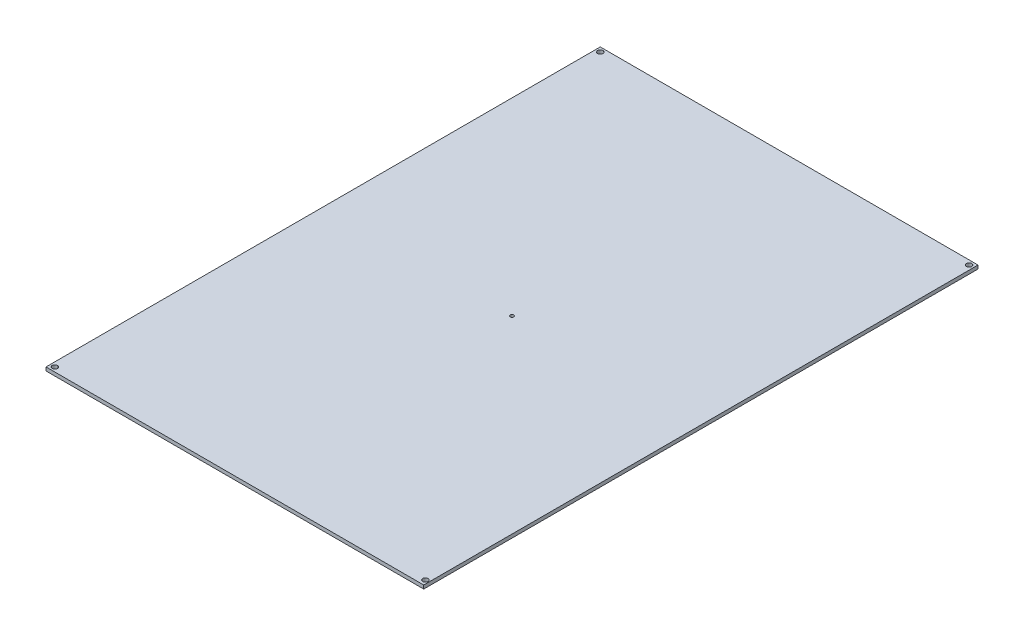
ISO-10303-21;
HEADER;
FILE_DESCRIPTION(('STEP AP214'),'2;1');
FILE_NAME('part.step','',(''),(''),'','','');
FILE_SCHEMA(('AUTOMOTIVE_DESIGN { 1 0 10303 214 1 1 1 1 }'));
ENDSEC;
DATA;
#1=APPLICATION_CONTEXT('core data for automotive mechanical design processes');
#2=APPLICATION_PROTOCOL_DEFINITION('international standard','automotive_design',2000,#1);
#3=PRODUCT_CONTEXT('',#1,'mechanical');
#4=PRODUCT('Part','Part','',(#3));
#5=PRODUCT_RELATED_PRODUCT_CATEGORY('part','',(#4));
#6=PRODUCT_DEFINITION_FORMATION('','',#4);
#7=PRODUCT_DEFINITION_CONTEXT('part definition',#1,'design');
#8=PRODUCT_DEFINITION('design','',#6,#7);
#9=PRODUCT_DEFINITION_SHAPE('','',#8);
#10=(LENGTH_UNIT() NAMED_UNIT(*) SI_UNIT(.MILLI.,.METRE.));
#11=(NAMED_UNIT(*) PLANE_ANGLE_UNIT() SI_UNIT($,.RADIAN.));
#12=(NAMED_UNIT(*) SI_UNIT($,.STERADIAN.) SOLID_ANGLE_UNIT());
#13=UNCERTAINTY_MEASURE_WITH_UNIT(LENGTH_MEASURE(1.E-05),#10,'distance_accuracy_value','');
#14=(GEOMETRIC_REPRESENTATION_CONTEXT(3) GLOBAL_UNCERTAINTY_ASSIGNED_CONTEXT((#13)) GLOBAL_UNIT_ASSIGNED_CONTEXT((#10,
#11,#12)) REPRESENTATION_CONTEXT('',''));
#15=CARTESIAN_POINT('',(0.,0.,0.));
#16=DIRECTION('',(0.,0.,1.));
#17=DIRECTION('',(1.,0.,0.));
#18=AXIS2_PLACEMENT_3D('',#15,#16,#17);
#19=CARTESIAN_POINT('',(0.,2.,0.));
#20=DIRECTION('',(0.,-1.,0.));
#21=DIRECTION('',(0.,0.,-1.));
#22=AXIS2_PLACEMENT_3D('',#19,#20,#21);
#23=PLANE('',#22);
#24=DIRECTION('',(0.,0.,-1.));
#25=VECTOR('',#24,1.);
#26=CARTESIAN_POINT('',(107.,2.,157.));
#27=LINE('',#26,#25);
#28=CARTESIAN_POINT('',(107.,2.,157.));
#29=VERTEX_POINT('',#28);
#30=CARTESIAN_POINT('',(107.,2.,-157.));
#31=VERTEX_POINT('',#30);
#32=EDGE_CURVE('E86',#29,#31,#27,.T.);
#33=ORIENTED_EDGE('',*,*,#32,.T.);
#34=DIRECTION('',(-1.,0.,0.));
#35=VECTOR('',#34,1.);
#36=CARTESIAN_POINT('',(-107.,2.,-157.));
#37=LINE('',#36,#35);
#38=CARTESIAN_POINT('',(-107.,2.,-157.));
#39=VERTEX_POINT('',#38);
#40=EDGE_CURVE('E81',#31,#39,#37,.T.);
#41=ORIENTED_EDGE('',*,*,#40,.T.);
#42=DIRECTION('',(0.,0.,1.));
#43=VECTOR('',#42,1.);
#44=CARTESIAN_POINT('',(-107.,2.,157.));
#45=LINE('',#44,#43);
#46=CARTESIAN_POINT('',(-107.,2.,157.));
#47=VERTEX_POINT('',#46);
#48=EDGE_CURVE('E84',#39,#47,#45,.T.);
#49=ORIENTED_EDGE('',*,*,#48,.T.);
#50=DIRECTION('',(1.,0.,0.));
#51=VECTOR('',#50,1.);
#52=CARTESIAN_POINT('',(-107.,2.,157.));
#53=LINE('',#52,#51);
#54=EDGE_CURVE('E51',#47,#29,#53,.T.);
#55=ORIENTED_EDGE('',*,*,#54,.T.);
#56=EDGE_LOOP('',(#33,#41,#49,#55));
#57=FACE_BOUND('',#56,.T.);
#58=CARTESIAN_POINT('',(-104.499999999994,2.,-154.500000000006));
#59=DIRECTION('',(0.,1.,0.));
#60=DIRECTION('',(0.,0.,1.));
#61=AXIS2_PLACEMENT_3D('',#58,#59,#60);
#62=CIRCLE('',#61,1.5);
#63=CARTESIAN_POINT('',(-104.499999999994,2.,-153.000000000006));
#64=VERTEX_POINT('',#63);
#65=EDGE_CURVE('E101',#64,#64,#62,.T.);
#66=ORIENTED_EDGE('',*,*,#65,.F.);
#67=EDGE_LOOP('',(#66));
#68=FACE_BOUND('',#67,.T.);
#69=CARTESIAN_POINT('',(0.,2.,0.));
#70=DIRECTION('',(0.,1.,0.));
#71=DIRECTION('',(0.,0.,1.));
#72=AXIS2_PLACEMENT_3D('',#69,#70,#71);
#73=CIRCLE('',#72,1.);
#74=CARTESIAN_POINT('',(0.,2.,1.));
#75=VERTEX_POINT('',#74);
#76=EDGE_CURVE('E116',#75,#75,#73,.T.);
#77=ORIENTED_EDGE('',*,*,#76,.F.);
#78=EDGE_LOOP('',(#77));
#79=FACE_BOUND('',#78,.T.);
#80=CARTESIAN_POINT('',(104.500000000006,2.,-154.5));
#81=DIRECTION('',(0.,1.,0.));
#82=DIRECTION('',(0.,0.,1.));
#83=AXIS2_PLACEMENT_3D('',#80,#81,#82);
#84=CIRCLE('',#83,1.5);
#85=CARTESIAN_POINT('',(104.500000000006,2.,-153.));
#86=VERTEX_POINT('',#85);
#87=EDGE_CURVE('E122',#86,#86,#84,.T.);
#88=ORIENTED_EDGE('',*,*,#87,.F.);
#89=EDGE_LOOP('',(#88));
#90=FACE_BOUND('',#89,.T.);
#91=CARTESIAN_POINT('',(105.00888101235,2.,154.078451578868));
#92=DIRECTION('',(0.,1.,0.));
#93=DIRECTION('',(0.,0.,1.));
#94=AXIS2_PLACEMENT_3D('',#91,#92,#93);
#95=CIRCLE('',#94,1.5);
#96=CARTESIAN_POINT('',(105.00888101235,2.,155.578451578868));
#97=VERTEX_POINT('',#96);
#98=EDGE_CURVE('E128',#97,#97,#95,.T.);
#99=ORIENTED_EDGE('',*,*,#98,.F.);
#100=EDGE_LOOP('',(#99));
#101=FACE_BOUND('',#100,.T.);
#102=CARTESIAN_POINT('',(-104.496841994602,2.,154.496841994597));
#103=DIRECTION('',(0.,1.,0.));
#104=DIRECTION('',(0.,0.,1.));
#105=AXIS2_PLACEMENT_3D('',#102,#103,#104);
#106=CIRCLE('',#105,1.5);
#107=CARTESIAN_POINT('',(-104.496841994602,2.,155.996841994597));
#108=VERTEX_POINT('',#107);
#109=EDGE_CURVE('E134',#108,#108,#106,.T.);
#110=ORIENTED_EDGE('',*,*,#109,.F.);
#111=EDGE_LOOP('',(#110));
#112=FACE_BOUND('',#111,.T.);
#113=ADVANCED_FACE('F34',(#57,#68,#79,#90,#101,#112),#23,.F.);
#114=CARTESIAN_POINT('',(0.,0.,0.));
#115=DIRECTION('',(0.,-1.,0.));
#116=DIRECTION('',(0.,0.,-1.));
#117=AXIS2_PLACEMENT_3D('',#114,#115,#116);
#118=PLANE('',#117);
#119=CARTESIAN_POINT('',(105.00888101235,0.,154.078451578868));
#120=DIRECTION('',(0.,1.,0.));
#121=DIRECTION('',(0.,0.,1.));
#122=AXIS2_PLACEMENT_3D('',#119,#120,#121);
#123=CIRCLE('',#122,1.5);
#124=CARTESIAN_POINT('',(105.00888101235,0.,155.578451578868));
#125=VERTEX_POINT('',#124);
#126=EDGE_CURVE('E131',#125,#125,#123,.T.);
#127=ORIENTED_EDGE('',*,*,#126,.T.);
#128=EDGE_LOOP('',(#127));
#129=FACE_BOUND('',#128,.T.);
#130=CARTESIAN_POINT('',(0.,0.,0.));
#131=DIRECTION('',(0.,1.,0.));
#132=DIRECTION('',(0.,0.,1.));
#133=AXIS2_PLACEMENT_3D('',#130,#131,#132);
#134=CIRCLE('',#133,1.);
#135=CARTESIAN_POINT('',(0.,0.,1.));
#136=VERTEX_POINT('',#135);
#137=EDGE_CURVE('E119',#136,#136,#134,.T.);
#138=ORIENTED_EDGE('',*,*,#137,.T.);
#139=EDGE_LOOP('',(#138));
#140=FACE_BOUND('',#139,.T.);
#141=DIRECTION('',(0.,0.,-1.));
#142=VECTOR('',#141,1.);
#143=CARTESIAN_POINT('',(107.,0.,157.));
#144=LINE('',#143,#142);
#145=CARTESIAN_POINT('',(107.,0.,157.));
#146=VERTEX_POINT('',#145);
#147=CARTESIAN_POINT('',(107.,0.,-157.));
#148=VERTEX_POINT('',#147);
#149=EDGE_CURVE('E98',#146,#148,#144,.T.);
#150=ORIENTED_EDGE('',*,*,#149,.F.);
#151=DIRECTION('',(1.,0.,0.));
#152=VECTOR('',#151,1.);
#153=CARTESIAN_POINT('',(-107.,0.,157.));
#154=LINE('',#153,#152);
#155=CARTESIAN_POINT('',(-107.,0.,157.));
#156=VERTEX_POINT('',#155);
#157=EDGE_CURVE('E74',#156,#146,#154,.T.);
#158=ORIENTED_EDGE('',*,*,#157,.F.);
#159=DIRECTION('',(0.,0.,1.));
#160=VECTOR('',#159,1.);
#161=CARTESIAN_POINT('',(-107.,0.,157.));
#162=LINE('',#161,#160);
#163=CARTESIAN_POINT('',(-107.,0.,-157.));
#164=VERTEX_POINT('',#163);
#165=EDGE_CURVE('E68',#164,#156,#162,.T.);
#166=ORIENTED_EDGE('',*,*,#165,.F.);
#167=DIRECTION('',(-1.,0.,0.));
#168=VECTOR('',#167,1.);
#169=CARTESIAN_POINT('',(-107.,0.,-157.));
#170=LINE('',#169,#168);
#171=EDGE_CURVE('E90',#148,#164,#170,.T.);
#172=ORIENTED_EDGE('',*,*,#171,.F.);
#173=EDGE_LOOP('',(#150,#158,#166,#172));
#174=FACE_BOUND('',#173,.T.);
#175=CARTESIAN_POINT('',(-104.499999999994,0.,-154.500000000006));
#176=DIRECTION('',(0.,1.,0.));
#177=DIRECTION('',(0.,0.,1.));
#178=AXIS2_PLACEMENT_3D('',#175,#176,#177);
#179=CIRCLE('',#178,1.5);
#180=CARTESIAN_POINT('',(-104.499999999994,0.,-153.000000000006));
#181=VERTEX_POINT('',#180);
#182=EDGE_CURVE('E113',#181,#181,#179,.T.);
#183=ORIENTED_EDGE('',*,*,#182,.T.);
#184=EDGE_LOOP('',(#183));
#185=FACE_BOUND('',#184,.T.);
#186=CARTESIAN_POINT('',(104.500000000006,0.,-154.5));
#187=DIRECTION('',(0.,1.,0.));
#188=DIRECTION('',(0.,0.,1.));
#189=AXIS2_PLACEMENT_3D('',#186,#187,#188);
#190=CIRCLE('',#189,1.5);
#191=CARTESIAN_POINT('',(104.500000000006,0.,-153.));
#192=VERTEX_POINT('',#191);
#193=EDGE_CURVE('E125',#192,#192,#190,.T.);
#194=ORIENTED_EDGE('',*,*,#193,.T.);
#195=EDGE_LOOP('',(#194));
#196=FACE_BOUND('',#195,.T.);
#197=CARTESIAN_POINT('',(-104.496841994602,0.,154.496841994597));
#198=DIRECTION('',(0.,1.,0.));
#199=DIRECTION('',(0.,0.,1.));
#200=AXIS2_PLACEMENT_3D('',#197,#198,#199);
#201=CIRCLE('',#200,1.5);
#202=CARTESIAN_POINT('',(-104.496841994602,0.,155.996841994597));
#203=VERTEX_POINT('',#202);
#204=EDGE_CURVE('E137',#203,#203,#201,.T.);
#205=ORIENTED_EDGE('',*,*,#204,.T.);
#206=EDGE_LOOP('',(#205));
#207=FACE_BOUND('',#206,.T.);
#208=ADVANCED_FACE('F109',(#129,#140,#174,#185,#196,#207),#118,.T.);
#209=CARTESIAN_POINT('',(107.,2.,157.));
#210=DIRECTION('',(-1.,0.,0.));
#211=DIRECTION('',(0.,0.,1.));
#212=AXIS2_PLACEMENT_3D('',#209,#210,#211);
#213=PLANE('',#212);
#214=ORIENTED_EDGE('',*,*,#149,.T.);
#215=DIRECTION('',(0.,-1.,0.));
#216=VECTOR('',#215,1.);
#217=CARTESIAN_POINT('',(107.,2.,-157.));
#218=LINE('',#217,#216);
#219=EDGE_CURVE('E11',#31,#148,#218,.T.);
#220=ORIENTED_EDGE('',*,*,#219,.F.);
#221=ORIENTED_EDGE('',*,*,#32,.F.);
#222=DIRECTION('',(0.,-1.,0.));
#223=VECTOR('',#222,1.);
#224=CARTESIAN_POINT('',(107.,2.,157.));
#225=LINE('',#224,#223);
#226=EDGE_CURVE('E94',#29,#146,#225,.T.);
#227=ORIENTED_EDGE('',*,*,#226,.T.);
#228=EDGE_LOOP('',(#214,#220,#221,#227));
#229=FACE_BOUND('',#228,.T.);
#230=ADVANCED_FACE('F36',(#229),#213,.F.);
#231=CARTESIAN_POINT('',(-107.,2.,-157.));
#232=DIRECTION('',(0.,0.,1.));
#233=DIRECTION('',(1.,0.,0.));
#234=AXIS2_PLACEMENT_3D('',#231,#232,#233);
#235=PLANE('',#234);
#236=ORIENTED_EDGE('',*,*,#171,.T.);
#237=DIRECTION('',(0.,-1.,0.));
#238=VECTOR('',#237,1.);
#239=CARTESIAN_POINT('',(-107.,2.,-157.));
#240=LINE('',#239,#238);
#241=EDGE_CURVE('E43',#39,#164,#240,.T.);
#242=ORIENTED_EDGE('',*,*,#241,.F.);
#243=ORIENTED_EDGE('',*,*,#40,.F.);
#244=ORIENTED_EDGE('',*,*,#219,.T.);
#245=EDGE_LOOP('',(#236,#242,#243,#244));
#246=FACE_BOUND('',#245,.T.);
#247=ADVANCED_FACE('F89',(#246),#235,.F.);
#248=CARTESIAN_POINT('',(-107.,2.,157.));
#249=DIRECTION('',(1.,0.,0.));
#250=DIRECTION('',(0.,0.,-1.));
#251=AXIS2_PLACEMENT_3D('',#248,#249,#250);
#252=PLANE('',#251);
#253=ORIENTED_EDGE('',*,*,#165,.T.);
#254=DIRECTION('',(0.,-1.,0.));
#255=VECTOR('',#254,1.);
#256=CARTESIAN_POINT('',(-107.,2.,157.));
#257=LINE('',#256,#255);
#258=EDGE_CURVE('E91',#47,#156,#257,.T.);
#259=ORIENTED_EDGE('',*,*,#258,.F.);
#260=ORIENTED_EDGE('',*,*,#48,.F.);
#261=ORIENTED_EDGE('',*,*,#241,.T.);
#262=EDGE_LOOP('',(#253,#259,#260,#261));
#263=FACE_BOUND('',#262,.T.);
#264=ADVANCED_FACE('F92',(#263),#252,.F.);
#265=CARTESIAN_POINT('',(-107.,2.,157.));
#266=DIRECTION('',(0.,0.,-1.));
#267=DIRECTION('',(-1.,0.,0.));
#268=AXIS2_PLACEMENT_3D('',#265,#266,#267);
#269=PLANE('',#268);
#270=ORIENTED_EDGE('',*,*,#157,.T.);
#271=ORIENTED_EDGE('',*,*,#226,.F.);
#272=ORIENTED_EDGE('',*,*,#54,.F.);
#273=ORIENTED_EDGE('',*,*,#258,.T.);
#274=EDGE_LOOP('',(#270,#271,#272,#273));
#275=FACE_BOUND('',#274,.T.);
#276=ADVANCED_FACE('F106',(#275),#269,.F.);
#277=CARTESIAN_POINT('',(-104.499999999994,2.,-154.500000000006));
#278=DIRECTION('',(0.,-1.,0.));
#279=DIRECTION('',(0.,0.,-1.));
#280=AXIS2_PLACEMENT_3D('',#277,#278,#279);
#281=CYLINDRICAL_SURFACE('',#280,1.5);
#282=ORIENTED_EDGE('',*,*,#65,.T.);
#283=EDGE_LOOP('',(#282));
#284=FACE_BOUND('',#283,.T.);
#285=ORIENTED_EDGE('',*,*,#182,.F.);
#286=EDGE_LOOP('',(#285));
#287=FACE_BOUND('',#286,.T.);
#288=ADVANCED_FACE('F154',(#284,#287),#281,.F.);
#289=CARTESIAN_POINT('',(0.,2.,0.));
#290=DIRECTION('',(0.,-1.,0.));
#291=DIRECTION('',(0.,0.,-1.));
#292=AXIS2_PLACEMENT_3D('',#289,#290,#291);
#293=CYLINDRICAL_SURFACE('',#292,1.);
#294=ORIENTED_EDGE('',*,*,#76,.T.);
#295=EDGE_LOOP('',(#294));
#296=FACE_BOUND('',#295,.T.);
#297=ORIENTED_EDGE('',*,*,#137,.F.);
#298=EDGE_LOOP('',(#297));
#299=FACE_BOUND('',#298,.T.);
#300=ADVANCED_FACE('F202',(#296,#299),#293,.F.);
#301=CARTESIAN_POINT('',(104.500000000006,2.,-154.5));
#302=DIRECTION('',(0.,-1.,0.));
#303=DIRECTION('',(0.,0.,-1.));
#304=AXIS2_PLACEMENT_3D('',#301,#302,#303);
#305=CYLINDRICAL_SURFACE('',#304,1.5);
#306=ORIENTED_EDGE('',*,*,#87,.T.);
#307=EDGE_LOOP('',(#306));
#308=FACE_BOUND('',#307,.T.);
#309=ORIENTED_EDGE('',*,*,#193,.F.);
#310=EDGE_LOOP('',(#309));
#311=FACE_BOUND('',#310,.T.);
#312=ADVANCED_FACE('F210',(#308,#311),#305,.F.);
#313=CARTESIAN_POINT('',(105.00888101235,2.,154.078451578868));
#314=DIRECTION('',(0.,-1.,0.));
#315=DIRECTION('',(0.,0.,-1.));
#316=AXIS2_PLACEMENT_3D('',#313,#314,#315);
#317=CYLINDRICAL_SURFACE('',#316,1.5);
#318=ORIENTED_EDGE('',*,*,#98,.T.);
#319=EDGE_LOOP('',(#318));
#320=FACE_BOUND('',#319,.T.);
#321=ORIENTED_EDGE('',*,*,#126,.F.);
#322=EDGE_LOOP('',(#321));
#323=FACE_BOUND('',#322,.T.);
#324=ADVANCED_FACE('F218',(#320,#323),#317,.F.);
#325=CARTESIAN_POINT('',(-104.496841994602,2.,154.496841994597));
#326=DIRECTION('',(0.,-1.,0.));
#327=DIRECTION('',(0.,0.,-1.));
#328=AXIS2_PLACEMENT_3D('',#325,#326,#327);
#329=CYLINDRICAL_SURFACE('',#328,1.5);
#330=ORIENTED_EDGE('',*,*,#109,.T.);
#331=EDGE_LOOP('',(#330));
#332=FACE_BOUND('',#331,.T.);
#333=ORIENTED_EDGE('',*,*,#204,.F.);
#334=EDGE_LOOP('',(#333));
#335=FACE_BOUND('',#334,.T.);
#336=ADVANCED_FACE('F143',(#332,#335),#329,.F.);
#337=CLOSED_SHELL('',(#113,#208,#230,#247,#264,#276,#288,#300,#312,#324,#336));
#338=MANIFOLD_SOLID_BREP('B2',#337);
#339=ADVANCED_BREP_SHAPE_REPRESENTATION('',(#18,#338),#14);
#340=SHAPE_DEFINITION_REPRESENTATION(#9,#339);
ENDSEC;
END-ISO-10303-21;
